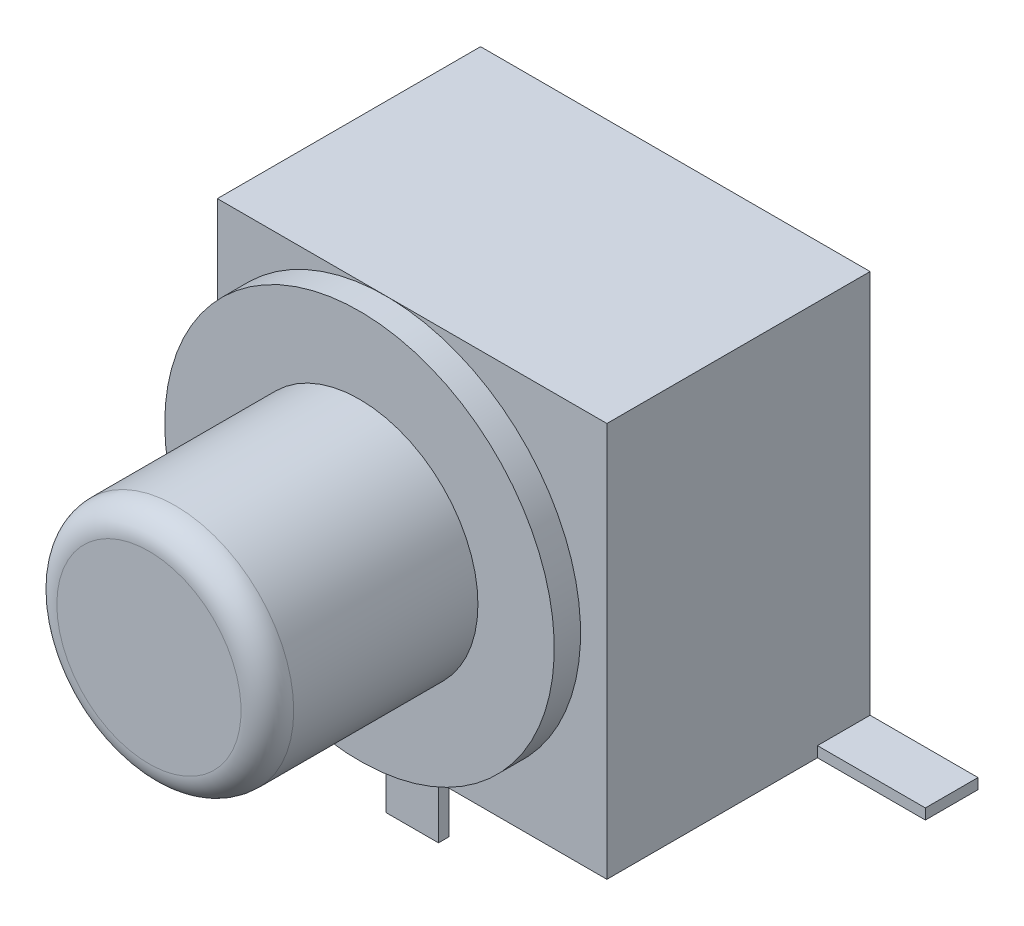
ISO-10303-21;
HEADER;
FILE_DESCRIPTION(('STEP AP214'),'2;1');
FILE_NAME('part.step','',(''),(''),'','','');
FILE_SCHEMA(('AUTOMOTIVE_DESIGN { 1 0 10303 214 1 1 1 1 }'));
ENDSEC;
DATA;
#1=APPLICATION_CONTEXT('core data for automotive mechanical design processes');
#2=APPLICATION_PROTOCOL_DEFINITION('international standard','automotive_design',2000,#1);
#3=PRODUCT_CONTEXT('',#1,'mechanical');
#4=PRODUCT('Part','Part','',(#3));
#5=PRODUCT_RELATED_PRODUCT_CATEGORY('part','',(#4));
#6=PRODUCT_DEFINITION_FORMATION('','',#4);
#7=PRODUCT_DEFINITION_CONTEXT('part definition',#1,'design');
#8=PRODUCT_DEFINITION('design','',#6,#7);
#9=PRODUCT_DEFINITION_SHAPE('','',#8);
#10=(LENGTH_UNIT() NAMED_UNIT(*) SI_UNIT(.MILLI.,.METRE.));
#11=(NAMED_UNIT(*) PLANE_ANGLE_UNIT() SI_UNIT($,.RADIAN.));
#12=(NAMED_UNIT(*) SI_UNIT($,.STERADIAN.) SOLID_ANGLE_UNIT());
#13=UNCERTAINTY_MEASURE_WITH_UNIT(LENGTH_MEASURE(1.E-05),#10,'distance_accuracy_value','');
#14=(GEOMETRIC_REPRESENTATION_CONTEXT(3) GLOBAL_UNCERTAINTY_ASSIGNED_CONTEXT((#13)) GLOBAL_UNIT_ASSIGNED_CONTEXT((#10,
#11,#12)) REPRESENTATION_CONTEXT('',''));
#15=CARTESIAN_POINT('',(0.,0.,0.));
#16=DIRECTION('',(0.,0.,1.));
#17=DIRECTION('',(1.,0.,0.));
#18=AXIS2_PLACEMENT_3D('',#15,#16,#17);
#19=CARTESIAN_POINT('',(-3.7,-3.75,5.));
#20=DIRECTION('',(0.,1.,0.));
#21=DIRECTION('',(-1.,0.,0.));
#22=AXIS2_PLACEMENT_3D('',#19,#20,#21);
#23=PLANE('',#22);
#24=DIRECTION('',(0.,0.,-1.));
#25=VECTOR('',#24,1.);
#26=CARTESIAN_POINT('',(-0.5,-3.75,5.));
#27=LINE('',#26,#25);
#28=CARTESIAN_POINT('',(-0.5,-3.75,5.));
#29=VERTEX_POINT('',#28);
#30=CARTESIAN_POINT('',(-0.5,-3.75,4.8));
#31=VERTEX_POINT('',#30);
#32=EDGE_CURVE('E207',#29,#31,#27,.T.);
#33=ORIENTED_EDGE('',*,*,#32,.F.);
#34=DIRECTION('',(1.,0.,0.));
#35=VECTOR('',#34,1.);
#36=CARTESIAN_POINT('',(-3.7,-3.75,5.));
#37=LINE('',#36,#35);
#38=CARTESIAN_POINT('',(-3.7,-3.75,5.));
#39=VERTEX_POINT('',#38);
#40=EDGE_CURVE('E274',#39,#29,#37,.T.);
#41=ORIENTED_EDGE('',*,*,#40,.F.);
#42=DIRECTION('',(0.,0.,-1.));
#43=VECTOR('',#42,1.);
#44=CARTESIAN_POINT('',(-3.7,-3.75,5.));
#45=LINE('',#44,#43);
#46=CARTESIAN_POINT('',(-3.7,-3.75,1.));
#47=VERTEX_POINT('',#46);
#48=EDGE_CURVE('E344',#39,#47,#45,.T.);
#49=ORIENTED_EDGE('',*,*,#48,.T.);
#50=DIRECTION('',(1.,0.,0.));
#51=VECTOR('',#50,1.);
#52=CARTESIAN_POINT('',(-5.75,-3.75,1.));
#53=LINE('',#52,#51);
#54=CARTESIAN_POINT('',(-5.75,-3.75,1.));
#55=VERTEX_POINT('',#54);
#56=EDGE_CURVE('E313',#55,#47,#53,.T.);
#57=ORIENTED_EDGE('',*,*,#56,.F.);
#58=DIRECTION('',(0.,0.,1.));
#59=VECTOR('',#58,1.);
#60=CARTESIAN_POINT('',(-5.75,-3.75,0.));
#61=LINE('',#60,#59);
#62=CARTESIAN_POINT('',(-5.75,-3.75,0.));
#63=VERTEX_POINT('',#62);
#64=EDGE_CURVE('E444',#63,#55,#61,.T.);
#65=ORIENTED_EDGE('',*,*,#64,.F.);
#66=DIRECTION('',(1.,0.,0.));
#67=VECTOR('',#66,1.);
#68=CARTESIAN_POINT('',(-3.7,-3.75,0.));
#69=LINE('',#68,#67);
#70=CARTESIAN_POINT('',(-2.6,-3.75,0.));
#71=VERTEX_POINT('',#70);
#72=EDGE_CURVE('E272',#63,#71,#69,.T.);
#73=ORIENTED_EDGE('',*,*,#72,.T.);
#74=DIRECTION('',(0.,0.,1.));
#75=VECTOR('',#74,1.);
#76=CARTESIAN_POINT('',(-2.6,-3.75,-1.));
#77=LINE('',#76,#75);
#78=CARTESIAN_POINT('',(-2.6,-3.75,-1.));
#79=VERTEX_POINT('',#78);
#80=EDGE_CURVE('E234',#79,#71,#77,.T.);
#81=ORIENTED_EDGE('',*,*,#80,.F.);
#82=DIRECTION('',(-1.,0.,0.));
#83=VECTOR('',#82,1.);
#84=CARTESIAN_POINT('',(-1.9,-3.75,-1.));
#85=LINE('',#84,#83);
#86=CARTESIAN_POINT('',(-1.9,-3.75,-1.));
#87=VERTEX_POINT('',#86);
#88=EDGE_CURVE('E219',#87,#79,#85,.T.);
#89=ORIENTED_EDGE('',*,*,#88,.F.);
#90=DIRECTION('',(0.,0.,1.));
#91=VECTOR('',#90,1.);
#92=CARTESIAN_POINT('',(-1.9,-3.75,-1.));
#93=LINE('',#92,#91);
#94=CARTESIAN_POINT('',(-1.9,-3.75,0.));
#95=VERTEX_POINT('',#94);
#96=EDGE_CURVE('E236',#87,#95,#93,.T.);
#97=ORIENTED_EDGE('',*,*,#96,.T.);
#98=CARTESIAN_POINT('',(1.9,-3.75,0.));
#99=VERTEX_POINT('',#98);
#100=EDGE_CURVE('E269',#95,#99,#69,.T.);
#101=ORIENTED_EDGE('',*,*,#100,.T.);
#102=DIRECTION('',(0.,0.,1.));
#103=VECTOR('',#102,1.);
#104=CARTESIAN_POINT('',(1.9,-3.75,-1.));
#105=LINE('',#104,#103);
#106=CARTESIAN_POINT('',(1.9,-3.75,-1.));
#107=VERTEX_POINT('',#106);
#108=EDGE_CURVE('E250',#107,#99,#105,.T.);
#109=ORIENTED_EDGE('',*,*,#108,.F.);
#110=DIRECTION('',(-1.,0.,0.));
#111=VECTOR('',#110,1.);
#112=CARTESIAN_POINT('',(1.9,-3.75,-1.));
#113=LINE('',#112,#111);
#114=CARTESIAN_POINT('',(2.6,-3.75,-1.));
#115=VERTEX_POINT('',#114);
#116=EDGE_CURVE('E248',#115,#107,#113,.T.);
#117=ORIENTED_EDGE('',*,*,#116,.F.);
#118=DIRECTION('',(0.,0.,1.));
#119=VECTOR('',#118,1.);
#120=CARTESIAN_POINT('',(2.6,-3.75,-1.));
#121=LINE('',#120,#119);
#122=CARTESIAN_POINT('',(2.6,-3.75,0.));
#123=VERTEX_POINT('',#122);
#124=EDGE_CURVE('E264',#115,#123,#121,.T.);
#125=ORIENTED_EDGE('',*,*,#124,.T.);
#126=CARTESIAN_POINT('',(5.75,-3.75,0.));
#127=VERTEX_POINT('',#126);
#128=EDGE_CURVE('E273',#123,#127,#69,.T.);
#129=ORIENTED_EDGE('',*,*,#128,.T.);
#130=DIRECTION('',(0.,0.,-1.));
#131=VECTOR('',#130,1.);
#132=CARTESIAN_POINT('',(5.75,-3.75,0.));
#133=LINE('',#132,#131);
#134=CARTESIAN_POINT('',(5.75,-3.75,1.));
#135=VERTEX_POINT('',#134);
#136=EDGE_CURVE('E322',#135,#127,#133,.T.);
#137=ORIENTED_EDGE('',*,*,#136,.F.);
#138=DIRECTION('',(-1.,0.,0.));
#139=VECTOR('',#138,1.);
#140=CARTESIAN_POINT('',(5.75,-3.75,1.));
#141=LINE('',#140,#139);
#142=CARTESIAN_POINT('',(3.7,-3.75,1.));
#143=VERTEX_POINT('',#142);
#144=EDGE_CURVE('E325',#135,#143,#141,.T.);
#145=ORIENTED_EDGE('',*,*,#144,.T.);
#146=DIRECTION('',(0.,0.,-1.));
#147=VECTOR('',#146,1.);
#148=CARTESIAN_POINT('',(3.7,-3.75,5.));
#149=LINE('',#148,#147);
#150=CARTESIAN_POINT('',(3.7,-3.75,5.));
#151=VERTEX_POINT('',#150);
#152=EDGE_CURVE('E349',#151,#143,#149,.T.);
#153=ORIENTED_EDGE('',*,*,#152,.F.);
#154=CARTESIAN_POINT('',(0.500000000000001,-3.75,5.));
#155=VERTEX_POINT('',#154);
#156=EDGE_CURVE('E58',#155,#151,#37,.T.);
#157=ORIENTED_EDGE('',*,*,#156,.F.);
#158=DIRECTION('',(0.,0.,1.));
#159=VECTOR('',#158,1.);
#160=CARTESIAN_POINT('',(0.5,-3.75,5.));
#161=LINE('',#160,#159);
#162=CARTESIAN_POINT('',(0.5,-3.75,4.8));
#163=VERTEX_POINT('',#162);
#164=EDGE_CURVE('E204',#163,#155,#161,.T.);
#165=ORIENTED_EDGE('',*,*,#164,.F.);
#166=DIRECTION('',(1.,0.,0.));
#167=VECTOR('',#166,1.);
#168=CARTESIAN_POINT('',(-0.5,-3.75,4.8));
#169=LINE('',#168,#167);
#170=EDGE_CURVE('E52',#31,#163,#169,.T.);
#171=ORIENTED_EDGE('',*,*,#170,.F.);
#172=EDGE_LOOP('',(#33,#41,#49,#57,#65,#73,#81,#89,#97,#101,#109,#117,#125,#129,#137,#145,#153,
#157,#165,#171));
#173=FACE_BOUND('',#172,.T.);
#174=ADVANCED_FACE('F35',(#173),#23,.F.);
#175=CARTESIAN_POINT('',(0.,0.,0.));
#176=DIRECTION('',(0.,0.,1.));
#177=DIRECTION('',(1.,0.,0.));
#178=AXIS2_PLACEMENT_3D('',#175,#176,#177);
#179=PLANE('',#178);
#180=DIRECTION('',(0.,-1.,0.));
#181=VECTOR('',#180,1.);
#182=CARTESIAN_POINT('',(-1.9,-3.55,0.));
#183=LINE('',#182,#181);
#184=CARTESIAN_POINT('',(-1.9,-3.55,0.));
#185=VERTEX_POINT('',#184);
#186=EDGE_CURVE('E208',#185,#95,#183,.T.);
#187=ORIENTED_EDGE('',*,*,#186,.F.);
#188=DIRECTION('',(1.,0.,0.));
#189=VECTOR('',#188,1.);
#190=CARTESIAN_POINT('',(-1.9,-3.55,0.));
#191=LINE('',#190,#189);
#192=CARTESIAN_POINT('',(-2.6,-3.55,0.));
#193=VERTEX_POINT('',#192);
#194=EDGE_CURVE('E220',#193,#185,#191,.T.);
#195=ORIENTED_EDGE('',*,*,#194,.F.);
#196=DIRECTION('',(0.,1.,0.));
#197=VECTOR('',#196,1.);
#198=CARTESIAN_POINT('',(-2.6,-3.55,0.));
#199=LINE('',#198,#197);
#200=EDGE_CURVE('E210',#71,#193,#199,.T.);
#201=ORIENTED_EDGE('',*,*,#200,.F.);
#202=ORIENTED_EDGE('',*,*,#72,.F.);
#203=DIRECTION('',(0.,-1.,0.));
#204=VECTOR('',#203,1.);
#205=CARTESIAN_POINT('',(-5.75,-3.75,0.));
#206=LINE('',#205,#204);
#207=CARTESIAN_POINT('',(-5.75,-3.55,0.));
#208=VERTEX_POINT('',#207);
#209=EDGE_CURVE('E303',#208,#63,#206,.T.);
#210=ORIENTED_EDGE('',*,*,#209,.F.);
#211=DIRECTION('',(1.,0.,0.));
#212=VECTOR('',#211,1.);
#213=CARTESIAN_POINT('',(-5.75,-3.55,0.));
#214=LINE('',#213,#212);
#215=CARTESIAN_POINT('',(-3.7,-3.55,0.));
#216=VERTEX_POINT('',#215);
#217=EDGE_CURVE('E294',#208,#216,#214,.T.);
#218=ORIENTED_EDGE('',*,*,#217,.T.);
#219=DIRECTION('',(0.,-1.,0.));
#220=VECTOR('',#219,1.);
#221=CARTESIAN_POINT('',(-3.7,3.75,0.));
#222=LINE('',#221,#220);
#223=CARTESIAN_POINT('',(-3.7,3.75,0.));
#224=VERTEX_POINT('',#223);
#225=EDGE_CURVE('E341',#224,#216,#222,.T.);
#226=ORIENTED_EDGE('',*,*,#225,.F.);
#227=DIRECTION('',(-1.,0.,0.));
#228=VECTOR('',#227,1.);
#229=CARTESIAN_POINT('',(-3.7,3.75,0.));
#230=LINE('',#229,#228);
#231=CARTESIAN_POINT('',(3.7,3.75,0.));
#232=VERTEX_POINT('',#231);
#233=EDGE_CURVE('E361',#232,#224,#230,.T.);
#234=ORIENTED_EDGE('',*,*,#233,.F.);
#235=DIRECTION('',(0.,1.,0.));
#236=VECTOR('',#235,1.);
#237=CARTESIAN_POINT('',(3.7,3.75,0.));
#238=LINE('',#237,#236);
#239=CARTESIAN_POINT('',(3.7,-3.54999999999999,0.));
#240=VERTEX_POINT('',#239);
#241=EDGE_CURVE('E291',#240,#232,#238,.T.);
#242=ORIENTED_EDGE('',*,*,#241,.F.);
#243=DIRECTION('',(-1.,0.,0.));
#244=VECTOR('',#243,1.);
#245=CARTESIAN_POINT('',(5.75,-3.55,0.));
#246=LINE('',#245,#244);
#247=CARTESIAN_POINT('',(5.75,-3.55,0.));
#248=VERTEX_POINT('',#247);
#249=EDGE_CURVE('E367',#248,#240,#246,.T.);
#250=ORIENTED_EDGE('',*,*,#249,.F.);
#251=DIRECTION('',(0.,1.,0.));
#252=VECTOR('',#251,1.);
#253=CARTESIAN_POINT('',(5.75,-3.75,0.));
#254=LINE('',#253,#252);
#255=EDGE_CURVE('E314',#127,#248,#254,.T.);
#256=ORIENTED_EDGE('',*,*,#255,.F.);
#257=ORIENTED_EDGE('',*,*,#128,.F.);
#258=DIRECTION('',(0.,-1.,0.));
#259=VECTOR('',#258,1.);
#260=CARTESIAN_POINT('',(2.6,-3.55,0.));
#261=LINE('',#260,#259);
#262=CARTESIAN_POINT('',(2.6,-3.55,0.));
#263=VERTEX_POINT('',#262);
#264=EDGE_CURVE('E244',#263,#123,#261,.T.);
#265=ORIENTED_EDGE('',*,*,#264,.F.);
#266=DIRECTION('',(1.,0.,0.));
#267=VECTOR('',#266,1.);
#268=CARTESIAN_POINT('',(1.9,-3.55,0.));
#269=LINE('',#268,#267);
#270=CARTESIAN_POINT('',(1.9,-3.55,0.));
#271=VERTEX_POINT('',#270);
#272=EDGE_CURVE('E251',#271,#263,#269,.T.);
#273=ORIENTED_EDGE('',*,*,#272,.F.);
#274=DIRECTION('',(0.,1.,0.));
#275=VECTOR('',#274,1.);
#276=CARTESIAN_POINT('',(1.9,-3.55,0.));
#277=LINE('',#276,#275);
#278=EDGE_CURVE('E239',#99,#271,#277,.T.);
#279=ORIENTED_EDGE('',*,*,#278,.F.);
#280=ORIENTED_EDGE('',*,*,#100,.F.);
#281=EDGE_LOOP('',(#187,#195,#201,#202,#210,#218,#226,#234,#242,#250,#256,#257,#265,#273,#279,#280));
#282=FACE_BOUND('',#281,.T.);
#283=ADVANCED_FACE('F389',(#282),#179,.F.);
#284=CARTESIAN_POINT('',(-3.7,3.75,5.));
#285=DIRECTION('',(1.,0.,0.));
#286=DIRECTION('',(0.,1.,0.));
#287=AXIS2_PLACEMENT_3D('',#284,#285,#286);
#288=PLANE('',#287);
#289=DIRECTION('',(0.,0.,-1.));
#290=VECTOR('',#289,1.);
#291=CARTESIAN_POINT('',(-3.7,-3.55,0.));
#292=LINE('',#291,#290);
#293=CARTESIAN_POINT('',(-3.7,-3.55,1.));
#294=VERTEX_POINT('',#293);
#295=EDGE_CURVE('E299',#294,#216,#292,.T.);
#296=ORIENTED_EDGE('',*,*,#295,.F.);
#297=DIRECTION('',(0.,1.,0.));
#298=VECTOR('',#297,1.);
#299=CARTESIAN_POINT('',(-3.7,-3.75,1.));
#300=LINE('',#299,#298);
#301=EDGE_CURVE('E304',#47,#294,#300,.T.);
#302=ORIENTED_EDGE('',*,*,#301,.F.);
#303=ORIENTED_EDGE('',*,*,#48,.F.);
#304=DIRECTION('',(0.,-1.,0.));
#305=VECTOR('',#304,1.);
#306=CARTESIAN_POINT('',(-3.7,3.75,5.));
#307=LINE('',#306,#305);
#308=CARTESIAN_POINT('',(-3.7,3.75,5.));
#309=VERTEX_POINT('',#308);
#310=EDGE_CURVE('E395',#309,#39,#307,.T.);
#311=ORIENTED_EDGE('',*,*,#310,.F.);
#312=DIRECTION('',(0.,0.,-1.));
#313=VECTOR('',#312,1.);
#314=CARTESIAN_POINT('',(-3.7,3.75,5.));
#315=LINE('',#314,#313);
#316=EDGE_CURVE('E399',#309,#224,#315,.T.);
#317=ORIENTED_EDGE('',*,*,#316,.T.);
#318=ORIENTED_EDGE('',*,*,#225,.T.);
#319=EDGE_LOOP('',(#296,#302,#303,#311,#317,#318));
#320=FACE_BOUND('',#319,.T.);
#321=ADVANCED_FACE('F481',(#320),#288,.F.);
#322=CARTESIAN_POINT('',(3.7,3.75,5.));
#323=DIRECTION('',(-1.,0.,0.));
#324=DIRECTION('',(0.,-1.,0.));
#325=AXIS2_PLACEMENT_3D('',#322,#323,#324);
#326=PLANE('',#325);
#327=DIRECTION('',(0.,-1.,0.));
#328=VECTOR('',#327,1.);
#329=CARTESIAN_POINT('',(3.7,-3.75,1.));
#330=LINE('',#329,#328);
#331=CARTESIAN_POINT('',(3.7,-3.55,1.));
#332=VERTEX_POINT('',#331);
#333=EDGE_CURVE('E318',#332,#143,#330,.T.);
#334=ORIENTED_EDGE('',*,*,#333,.F.);
#335=DIRECTION('',(0.,0.,1.));
#336=VECTOR('',#335,1.);
#337=CARTESIAN_POINT('',(3.7,-3.55,0.));
#338=LINE('',#337,#336);
#339=EDGE_CURVE('E334',#240,#332,#338,.T.);
#340=ORIENTED_EDGE('',*,*,#339,.F.);
#341=ORIENTED_EDGE('',*,*,#241,.T.);
#342=DIRECTION('',(0.,0.,-1.));
#343=VECTOR('',#342,1.);
#344=CARTESIAN_POINT('',(3.7,3.75,5.));
#345=LINE('',#344,#343);
#346=CARTESIAN_POINT('',(3.7,3.75,5.));
#347=VERTEX_POINT('',#346);
#348=EDGE_CURVE('E363',#347,#232,#345,.T.);
#349=ORIENTED_EDGE('',*,*,#348,.F.);
#350=DIRECTION('',(0.,1.,0.));
#351=VECTOR('',#350,1.);
#352=CARTESIAN_POINT('',(3.7,3.75,5.));
#353=LINE('',#352,#351);
#354=EDGE_CURVE('E404',#151,#347,#353,.T.);
#355=ORIENTED_EDGE('',*,*,#354,.F.);
#356=ORIENTED_EDGE('',*,*,#152,.T.);
#357=EDGE_LOOP('',(#334,#340,#341,#349,#355,#356));
#358=FACE_BOUND('',#357,.T.);
#359=ADVANCED_FACE('F383',(#358),#326,.F.);
#360=CARTESIAN_POINT('',(0.,0.550000000000001,7.2));
#361=DIRECTION('',(0.,0.,-1.));
#362=DIRECTION('',(-1.,0.,0.));
#363=AXIS2_PLACEMENT_3D('',#360,#361,#362);
#364=CYLINDRICAL_SURFACE('',#363,1.75);
#365=CARTESIAN_POINT('',(0.,0.550000000000001,5.));
#366=DIRECTION('',(0.,0.,1.));
#367=DIRECTION('',(1.,0.,0.));
#368=AXIS2_PLACEMENT_3D('',#365,#366,#367);
#369=CIRCLE('',#368,1.75);
#370=CARTESIAN_POINT('',(1.75,0.550000000000001,5.));
#371=VERTEX_POINT('',#370);
#372=EDGE_CURVE('E343',#371,#371,#369,.T.);
#373=ORIENTED_EDGE('',*,*,#372,.T.);
#374=EDGE_LOOP('',(#373));
#375=FACE_BOUND('',#374,.T.);
#376=CARTESIAN_POINT('',(0.,0.550000000000001,5.5));
#377=DIRECTION('',(0.,0.,1.));
#378=DIRECTION('',(1.,0.,0.));
#379=AXIS2_PLACEMENT_3D('',#376,#377,#378);
#380=CIRCLE('',#379,1.75);
#381=CARTESIAN_POINT('',(1.75,0.550000000000001,5.5));
#382=VERTEX_POINT('',#381);
#383=EDGE_CURVE('E348',#382,#382,#380,.T.);
#384=ORIENTED_EDGE('',*,*,#383,.F.);
#385=EDGE_LOOP('',(#384));
#386=FACE_BOUND('',#385,.T.);
#387=ADVANCED_FACE('F489',(#375,#386),#364,.T.);
#388=CARTESIAN_POINT('',(0.,0.,5.));
#389=DIRECTION('',(0.,0.,1.));
#390=DIRECTION('',(1.,0.,0.));
#391=AXIS2_PLACEMENT_3D('',#388,#389,#390);
#392=PLANE('',#391);
#393=ORIENTED_EDGE('',*,*,#310,.T.);
#394=ORIENTED_EDGE('',*,*,#40,.T.);
#395=DIRECTION('',(0.,1.,0.));
#396=VECTOR('',#395,1.);
#397=CARTESIAN_POINT('',(-0.499999999999999,-4.75,5.));
#398=LINE('',#397,#396);
#399=CARTESIAN_POINT('',(-0.499999999999999,-4.75,5.));
#400=VERTEX_POINT('',#399);
#401=EDGE_CURVE('E415',#400,#29,#398,.T.);
#402=ORIENTED_EDGE('',*,*,#401,.F.);
#403=DIRECTION('',(-1.,0.,0.));
#404=VECTOR('',#403,1.);
#405=CARTESIAN_POINT('',(-0.499999999999999,-4.75,5.));
#406=LINE('',#405,#404);
#407=CARTESIAN_POINT('',(0.500000000000001,-4.75,5.));
#408=VERTEX_POINT('',#407);
#409=EDGE_CURVE('E200',#408,#400,#406,.T.);
#410=ORIENTED_EDGE('',*,*,#409,.F.);
#411=DIRECTION('',(0.,1.,0.));
#412=VECTOR('',#411,1.);
#413=CARTESIAN_POINT('',(0.500000000000001,-4.75,5.));
#414=LINE('',#413,#412);
#415=EDGE_CURVE('E212',#408,#155,#414,.T.);
#416=ORIENTED_EDGE('',*,*,#415,.T.);
#417=ORIENTED_EDGE('',*,*,#156,.T.);
#418=ORIENTED_EDGE('',*,*,#354,.T.);
#419=DIRECTION('',(-1.,0.,0.));
#420=VECTOR('',#419,1.);
#421=CARTESIAN_POINT('',(-3.7,3.75,5.));
#422=LINE('',#421,#420);
#423=EDGE_CURVE('E400',#347,#309,#422,.T.);
#424=ORIENTED_EDGE('',*,*,#423,.T.);
#425=EDGE_LOOP('',(#393,#394,#402,#410,#416,#417,#418,#424));
#426=FACE_BOUND('',#425,.T.);
#427=ORIENTED_EDGE('',*,*,#372,.F.);
#428=EDGE_LOOP('',(#427));
#429=FACE_BOUND('',#428,.T.);
#430=ADVANCED_FACE('F427',(#426,#429),#392,.T.);
#431=CARTESIAN_POINT('',(-3.7,3.75,5.));
#432=DIRECTION('',(0.,-1.,0.));
#433=DIRECTION('',(1.,0.,0.));
#434=AXIS2_PLACEMENT_3D('',#431,#432,#433);
#435=PLANE('',#434);
#436=ORIENTED_EDGE('',*,*,#233,.T.);
#437=ORIENTED_EDGE('',*,*,#316,.F.);
#438=ORIENTED_EDGE('',*,*,#423,.F.);
#439=ORIENTED_EDGE('',*,*,#348,.T.);
#440=EDGE_LOOP('',(#436,#437,#438,#439));
#441=FACE_BOUND('',#440,.T.);
#442=ADVANCED_FACE('F402',(#441),#435,.F.);
#443=CARTESIAN_POINT('',(0.,0.55,5.5));
#444=DIRECTION('',(0.,0.,1.));
#445=DIRECTION('',(1.,0.,0.));
#446=AXIS2_PLACEMENT_3D('',#443,#444,#445);
#447=PLANE('',#446);
#448=CARTESIAN_POINT('',(0.,0.55,5.5));
#449=DIRECTION('',(0.,0.,-1.));
#450=DIRECTION('',(-1.,0.,0.));
#451=AXIS2_PLACEMENT_3D('',#448,#449,#450);
#452=CIRCLE('',#451,3.7);
#453=CARTESIAN_POINT('',(-3.7,0.55,5.5));
#454=VERTEX_POINT('',#453);
#455=EDGE_CURVE('E369',#454,#454,#452,.T.);
#456=ORIENTED_EDGE('',*,*,#455,.T.);
#457=EDGE_LOOP('',(#456));
#458=FACE_BOUND('',#457,.T.);
#459=ORIENTED_EDGE('',*,*,#383,.T.);
#460=EDGE_LOOP('',(#459));
#461=FACE_BOUND('',#460,.T.);
#462=ADVANCED_FACE('F639',(#458,#461),#447,.F.);
#463=CARTESIAN_POINT('',(2.25,0.55,10.));
#464=DIRECTION('',(0.,0.,-1.));
#465=DIRECTION('',(-1.,0.,0.));
#466=AXIS2_PLACEMENT_3D('',#463,#464,#465);
#467=PLANE('',#466);
#468=CARTESIAN_POINT('',(0.,0.55,10.));
#469=DIRECTION('',(0.,0.,-1.));
#470=DIRECTION('',(-1.,0.,0.));
#471=AXIS2_PLACEMENT_3D('',#468,#469,#470);
#472=CIRCLE('',#471,1.75);
#473=CARTESIAN_POINT('',(-1.75,0.55,10.));
#474=VERTEX_POINT('',#473);
#475=EDGE_CURVE('E11',#474,#474,#472,.F.);
#476=ORIENTED_EDGE('',*,*,#475,.T.);
#477=EDGE_LOOP('',(#476));
#478=FACE_BOUND('',#477,.T.);
#479=ADVANCED_FACE('F645',(#478),#467,.F.);
#480=CARTESIAN_POINT('',(0.,0.55,-1.83117888934429));
#481=DIRECTION('',(0.,0.,-1.));
#482=DIRECTION('',(-1.,0.,0.));
#483=AXIS2_PLACEMENT_3D('',#480,#481,#482);
#484=CYLINDRICAL_SURFACE('',#483,2.25);
#485=CARTESIAN_POINT('',(0.,0.55,9.5));
#486=DIRECTION('',(0.,0.,-1.));
#487=DIRECTION('',(-1.,0.,0.));
#488=AXIS2_PLACEMENT_3D('',#485,#486,#487);
#489=CIRCLE('',#488,2.25);
#490=CARTESIAN_POINT('',(-2.25,0.55,9.5));
#491=VERTEX_POINT('',#490);
#492=EDGE_CURVE('E44',#491,#491,#489,.T.);
#493=ORIENTED_EDGE('',*,*,#492,.T.);
#494=EDGE_LOOP('',(#493));
#495=FACE_BOUND('',#494,.T.);
#496=CARTESIAN_POINT('',(0.,0.55,6.));
#497=DIRECTION('',(0.,0.,-1.));
#498=DIRECTION('',(-1.,0.,0.));
#499=AXIS2_PLACEMENT_3D('',#496,#497,#498);
#500=CIRCLE('',#499,2.25);
#501=CARTESIAN_POINT('',(-2.25,0.55,6.));
#502=VERTEX_POINT('',#501);
#503=EDGE_CURVE('E769',#502,#502,#500,.T.);
#504=ORIENTED_EDGE('',*,*,#503,.F.);
#505=EDGE_LOOP('',(#504));
#506=FACE_BOUND('',#505,.T.);
#507=ADVANCED_FACE('F654',(#495,#506),#484,.T.);
#508=CARTESIAN_POINT('',(3.7,0.550000000000001,6.));
#509=DIRECTION('',(0.,0.,-1.));
#510=DIRECTION('',(-1.,0.,0.));
#511=AXIS2_PLACEMENT_3D('',#508,#509,#510);
#512=PLANE('',#511);
#513=CARTESIAN_POINT('',(0.,0.55,6.));
#514=DIRECTION('',(0.,0.,-1.));
#515=DIRECTION('',(-1.,0.,0.));
#516=AXIS2_PLACEMENT_3D('',#513,#514,#515);
#517=CIRCLE('',#516,3.7);
#518=CARTESIAN_POINT('',(-3.7,0.55,6.));
#519=VERTEX_POINT('',#518);
#520=EDGE_CURVE('E373',#519,#519,#517,.T.);
#521=ORIENTED_EDGE('',*,*,#520,.F.);
#522=EDGE_LOOP('',(#521));
#523=FACE_BOUND('',#522,.T.);
#524=ORIENTED_EDGE('',*,*,#503,.T.);
#525=EDGE_LOOP('',(#524));
#526=FACE_BOUND('',#525,.T.);
#527=ADVANCED_FACE('F663',(#523,#526),#512,.F.);
#528=CARTESIAN_POINT('',(0.,0.55,-1.83117888934429));
#529=DIRECTION('',(0.,0.,-1.));
#530=DIRECTION('',(-1.,0.,0.));
#531=AXIS2_PLACEMENT_3D('',#528,#529,#530);
#532=CYLINDRICAL_SURFACE('',#531,3.7);
#533=ORIENTED_EDGE('',*,*,#455,.F.);
#534=EDGE_LOOP('',(#533));
#535=FACE_BOUND('',#534,.T.);
#536=ORIENTED_EDGE('',*,*,#520,.T.);
#537=EDGE_LOOP('',(#536));
#538=FACE_BOUND('',#537,.T.);
#539=ADVANCED_FACE('F671',(#535,#538),#532,.T.);
#540=CARTESIAN_POINT('',(0.,0.55,9.5));
#541=DIRECTION('',(0.,0.,-1.));
#542=DIRECTION('',(-1.,0.,0.));
#543=AXIS2_PLACEMENT_3D('',#540,#541,#542);
#544=TOROIDAL_SURFACE('',#543,1.75,0.5);
#545=ORIENTED_EDGE('',*,*,#475,.F.);
#546=EDGE_LOOP('',(#545));
#547=FACE_BOUND('',#546,.T.);
#548=ORIENTED_EDGE('',*,*,#492,.F.);
#549=EDGE_LOOP('',(#548));
#550=FACE_BOUND('',#549,.T.);
#551=ADVANCED_FACE('F37',(#547,#550),#544,.T.);
#552=CARTESIAN_POINT('',(5.75,-3.55,0.));
#553=DIRECTION('',(0.,-1.,0.));
#554=DIRECTION('',(1.,0.,0.));
#555=AXIS2_PLACEMENT_3D('',#552,#553,#554);
#556=PLANE('',#555);
#557=ORIENTED_EDGE('',*,*,#339,.T.);
#558=DIRECTION('',(-1.,0.,0.));
#559=VECTOR('',#558,1.);
#560=CARTESIAN_POINT('',(5.75,-3.55,1.));
#561=LINE('',#560,#559);
#562=CARTESIAN_POINT('',(5.75,-3.55,1.));
#563=VERTEX_POINT('',#562);
#564=EDGE_CURVE('E328',#563,#332,#561,.T.);
#565=ORIENTED_EDGE('',*,*,#564,.F.);
#566=DIRECTION('',(0.,0.,1.));
#567=VECTOR('',#566,1.);
#568=CARTESIAN_POINT('',(5.75,-3.55,0.));
#569=LINE('',#568,#567);
#570=EDGE_CURVE('E317',#248,#563,#569,.T.);
#571=ORIENTED_EDGE('',*,*,#570,.F.);
#572=ORIENTED_EDGE('',*,*,#249,.T.);
#573=EDGE_LOOP('',(#557,#565,#571,#572));
#574=FACE_BOUND('',#573,.T.);
#575=ADVANCED_FACE('F380',(#574),#556,.F.);
#576=CARTESIAN_POINT('',(5.75,-3.75,1.));
#577=DIRECTION('',(0.,0.,-1.));
#578=DIRECTION('',(-1.,0.,0.));
#579=AXIS2_PLACEMENT_3D('',#576,#577,#578);
#580=PLANE('',#579);
#581=ORIENTED_EDGE('',*,*,#333,.T.);
#582=ORIENTED_EDGE('',*,*,#144,.F.);
#583=DIRECTION('',(0.,-1.,0.));
#584=VECTOR('',#583,1.);
#585=CARTESIAN_POINT('',(5.75,-3.75,1.));
#586=LINE('',#585,#584);
#587=EDGE_CURVE('E320',#563,#135,#586,.T.);
#588=ORIENTED_EDGE('',*,*,#587,.F.);
#589=ORIENTED_EDGE('',*,*,#564,.T.);
#590=EDGE_LOOP('',(#581,#582,#588,#589));
#591=FACE_BOUND('',#590,.T.);
#592=ADVANCED_FACE('F378',(#591),#580,.F.);
#593=CARTESIAN_POINT('',(5.74999999999999,0.,0.));
#594=DIRECTION('',(1.,0.,0.));
#595=DIRECTION('',(0.,1.,0.));
#596=AXIS2_PLACEMENT_3D('',#593,#594,#595);
#597=PLANE('',#596);
#598=ORIENTED_EDGE('',*,*,#255,.T.);
#599=ORIENTED_EDGE('',*,*,#570,.T.);
#600=ORIENTED_EDGE('',*,*,#587,.T.);
#601=ORIENTED_EDGE('',*,*,#136,.T.);
#602=EDGE_LOOP('',(#598,#599,#600,#601));
#603=FACE_BOUND('',#602,.T.);
#604=ADVANCED_FACE('F466',(#603),#597,.T.);
#605=CARTESIAN_POINT('',(-5.75,-3.75,1.));
#606=DIRECTION('',(0.,0.,-1.));
#607=DIRECTION('',(-1.,0.,0.));
#608=AXIS2_PLACEMENT_3D('',#605,#606,#607);
#609=PLANE('',#608);
#610=ORIENTED_EDGE('',*,*,#301,.T.);
#611=DIRECTION('',(1.,0.,0.));
#612=VECTOR('',#611,1.);
#613=CARTESIAN_POINT('',(-5.75,-3.55,1.));
#614=LINE('',#613,#612);
#615=CARTESIAN_POINT('',(-5.75,-3.55,1.));
#616=VERTEX_POINT('',#615);
#617=EDGE_CURVE('E297',#616,#294,#614,.T.);
#618=ORIENTED_EDGE('',*,*,#617,.F.);
#619=DIRECTION('',(0.,1.,0.));
#620=VECTOR('',#619,1.);
#621=CARTESIAN_POINT('',(-5.75,-3.75,1.));
#622=LINE('',#621,#620);
#623=EDGE_CURVE('E440',#55,#616,#622,.T.);
#624=ORIENTED_EDGE('',*,*,#623,.F.);
#625=ORIENTED_EDGE('',*,*,#56,.T.);
#626=EDGE_LOOP('',(#610,#618,#624,#625));
#627=FACE_BOUND('',#626,.T.);
#628=ADVANCED_FACE('F438',(#627),#609,.F.);
#629=CARTESIAN_POINT('',(-5.75,-3.55,0.));
#630=DIRECTION('',(0.,-1.,0.));
#631=DIRECTION('',(1.,0.,0.));
#632=AXIS2_PLACEMENT_3D('',#629,#630,#631);
#633=PLANE('',#632);
#634=ORIENTED_EDGE('',*,*,#295,.T.);
#635=ORIENTED_EDGE('',*,*,#217,.F.);
#636=DIRECTION('',(0.,0.,-1.));
#637=VECTOR('',#636,1.);
#638=CARTESIAN_POINT('',(-5.75,-3.55,0.));
#639=LINE('',#638,#637);
#640=EDGE_CURVE('E298',#616,#208,#639,.T.);
#641=ORIENTED_EDGE('',*,*,#640,.F.);
#642=ORIENTED_EDGE('',*,*,#617,.T.);
#643=EDGE_LOOP('',(#634,#635,#641,#642));
#644=FACE_BOUND('',#643,.T.);
#645=ADVANCED_FACE('F473',(#644),#633,.F.);
#646=CARTESIAN_POINT('',(-5.75000000000001,0.,0.));
#647=DIRECTION('',(1.,0.,0.));
#648=DIRECTION('',(0.,1.,0.));
#649=AXIS2_PLACEMENT_3D('',#646,#647,#648);
#650=PLANE('',#649);
#651=ORIENTED_EDGE('',*,*,#209,.T.);
#652=ORIENTED_EDGE('',*,*,#64,.T.);
#653=ORIENTED_EDGE('',*,*,#623,.T.);
#654=ORIENTED_EDGE('',*,*,#640,.T.);
#655=EDGE_LOOP('',(#651,#652,#653,#654));
#656=FACE_BOUND('',#655,.T.);
#657=ADVANCED_FACE('F494',(#656),#650,.F.);
#658=CARTESIAN_POINT('',(1.9,-3.55,-1.));
#659=DIRECTION('',(1.,0.,0.));
#660=DIRECTION('',(0.,1.,0.));
#661=AXIS2_PLACEMENT_3D('',#658,#659,#660);
#662=PLANE('',#661);
#663=ORIENTED_EDGE('',*,*,#278,.T.);
#664=DIRECTION('',(0.,0.,1.));
#665=VECTOR('',#664,1.);
#666=CARTESIAN_POINT('',(1.9,-3.55,-1.));
#667=LINE('',#666,#665);
#668=CARTESIAN_POINT('',(1.9,-3.55,-1.));
#669=VERTEX_POINT('',#668);
#670=EDGE_CURVE('E448',#669,#271,#667,.T.);
#671=ORIENTED_EDGE('',*,*,#670,.F.);
#672=DIRECTION('',(0.,1.,0.));
#673=VECTOR('',#672,1.);
#674=CARTESIAN_POINT('',(1.9,-3.55,-1.));
#675=LINE('',#674,#673);
#676=EDGE_CURVE('E240',#107,#669,#675,.T.);
#677=ORIENTED_EDGE('',*,*,#676,.F.);
#678=ORIENTED_EDGE('',*,*,#108,.T.);
#679=EDGE_LOOP('',(#663,#671,#677,#678));
#680=FACE_BOUND('',#679,.T.);
#681=ADVANCED_FACE('F532',(#680),#662,.F.);
#682=CARTESIAN_POINT('',(1.9,-3.55,-1.));
#683=DIRECTION('',(0.,-1.,0.));
#684=DIRECTION('',(1.,0.,0.));
#685=AXIS2_PLACEMENT_3D('',#682,#683,#684);
#686=PLANE('',#685);
#687=ORIENTED_EDGE('',*,*,#272,.T.);
#688=DIRECTION('',(0.,0.,1.));
#689=VECTOR('',#688,1.);
#690=CARTESIAN_POINT('',(2.6,-3.55,-1.));
#691=LINE('',#690,#689);
#692=CARTESIAN_POINT('',(2.6,-3.55,-1.));
#693=VERTEX_POINT('',#692);
#694=EDGE_CURVE('E256',#693,#263,#691,.T.);
#695=ORIENTED_EDGE('',*,*,#694,.F.);
#696=DIRECTION('',(1.,0.,0.));
#697=VECTOR('',#696,1.);
#698=CARTESIAN_POINT('',(1.9,-3.55,-1.));
#699=LINE('',#698,#697);
#700=EDGE_CURVE('E243',#669,#693,#699,.T.);
#701=ORIENTED_EDGE('',*,*,#700,.F.);
#702=ORIENTED_EDGE('',*,*,#670,.T.);
#703=EDGE_LOOP('',(#687,#695,#701,#702));
#704=FACE_BOUND('',#703,.T.);
#705=ADVANCED_FACE('F459',(#704),#686,.F.);
#706=CARTESIAN_POINT('',(2.6,-3.55,-1.));
#707=DIRECTION('',(-1.,0.,0.));
#708=DIRECTION('',(0.,-1.,0.));
#709=AXIS2_PLACEMENT_3D('',#706,#707,#708);
#710=PLANE('',#709);
#711=ORIENTED_EDGE('',*,*,#264,.T.);
#712=ORIENTED_EDGE('',*,*,#124,.F.);
#713=DIRECTION('',(0.,-1.,0.));
#714=VECTOR('',#713,1.);
#715=CARTESIAN_POINT('',(2.6,-3.55,-1.));
#716=LINE('',#715,#714);
#717=EDGE_CURVE('E246',#693,#115,#716,.T.);
#718=ORIENTED_EDGE('',*,*,#717,.F.);
#719=ORIENTED_EDGE('',*,*,#694,.T.);
#720=EDGE_LOOP('',(#711,#712,#718,#719));
#721=FACE_BOUND('',#720,.T.);
#722=ADVANCED_FACE('F457',(#721),#710,.F.);
#723=CARTESIAN_POINT('',(0.,0.,-1.));
#724=DIRECTION('',(0.,0.,1.));
#725=DIRECTION('',(1.,0.,0.));
#726=AXIS2_PLACEMENT_3D('',#723,#724,#725);
#727=PLANE('',#726);
#728=ORIENTED_EDGE('',*,*,#676,.T.);
#729=ORIENTED_EDGE('',*,*,#700,.T.);
#730=ORIENTED_EDGE('',*,*,#717,.T.);
#731=ORIENTED_EDGE('',*,*,#116,.T.);
#732=EDGE_LOOP('',(#728,#729,#730,#731));
#733=FACE_BOUND('',#732,.T.);
#734=ADVANCED_FACE('F524',(#733),#727,.F.);
#735=CARTESIAN_POINT('',(-1.9,-3.55,-1.));
#736=DIRECTION('',(-1.,0.,0.));
#737=DIRECTION('',(0.,0.,1.));
#738=AXIS2_PLACEMENT_3D('',#735,#736,#737);
#739=PLANE('',#738);
#740=ORIENTED_EDGE('',*,*,#186,.T.);
#741=ORIENTED_EDGE('',*,*,#96,.F.);
#742=DIRECTION('',(0.,-1.,0.));
#743=VECTOR('',#742,1.);
#744=CARTESIAN_POINT('',(-1.9,-3.55,-1.));
#745=LINE('',#744,#743);
#746=CARTESIAN_POINT('',(-1.9,-3.55,-1.));
#747=VERTEX_POINT('',#746);
#748=EDGE_CURVE('E216',#747,#87,#745,.T.);
#749=ORIENTED_EDGE('',*,*,#748,.F.);
#750=DIRECTION('',(0.,0.,1.));
#751=VECTOR('',#750,1.);
#752=CARTESIAN_POINT('',(-1.9,-3.55,-1.));
#753=LINE('',#752,#751);
#754=EDGE_CURVE('E225',#747,#185,#753,.T.);
#755=ORIENTED_EDGE('',*,*,#754,.T.);
#756=EDGE_LOOP('',(#740,#741,#749,#755));
#757=FACE_BOUND('',#756,.T.);
#758=ADVANCED_FACE('F507',(#757),#739,.F.);
#759=CARTESIAN_POINT('',(-2.6,-3.55,-1.));
#760=DIRECTION('',(1.,0.,0.));
#761=DIRECTION('',(0.,1.,0.));
#762=AXIS2_PLACEMENT_3D('',#759,#760,#761);
#763=PLANE('',#762);
#764=ORIENTED_EDGE('',*,*,#200,.T.);
#765=DIRECTION('',(0.,0.,1.));
#766=VECTOR('',#765,1.);
#767=CARTESIAN_POINT('',(-2.6,-3.55,-1.));
#768=LINE('',#767,#766);
#769=CARTESIAN_POINT('',(-2.6,-3.55,-1.));
#770=VERTEX_POINT('',#769);
#771=EDGE_CURVE('E231',#770,#193,#768,.T.);
#772=ORIENTED_EDGE('',*,*,#771,.F.);
#773=DIRECTION('',(0.,1.,0.));
#774=VECTOR('',#773,1.);
#775=CARTESIAN_POINT('',(-2.6,-3.55,-1.));
#776=LINE('',#775,#774);
#777=EDGE_CURVE('E222',#79,#770,#776,.T.);
#778=ORIENTED_EDGE('',*,*,#777,.F.);
#779=ORIENTED_EDGE('',*,*,#80,.T.);
#780=EDGE_LOOP('',(#764,#772,#778,#779));
#781=FACE_BOUND('',#780,.T.);
#782=ADVANCED_FACE('F499',(#781),#763,.F.);
#783=CARTESIAN_POINT('',(-1.9,-3.55,-1.));
#784=DIRECTION('',(0.,-1.,0.));
#785=DIRECTION('',(0.,0.,-1.));
#786=AXIS2_PLACEMENT_3D('',#783,#784,#785);
#787=PLANE('',#786);
#788=ORIENTED_EDGE('',*,*,#194,.T.);
#789=ORIENTED_EDGE('',*,*,#754,.F.);
#790=DIRECTION('',(1.,0.,0.));
#791=VECTOR('',#790,1.);
#792=CARTESIAN_POINT('',(-1.9,-3.55,-1.));
#793=LINE('',#792,#791);
#794=EDGE_CURVE('E224',#770,#747,#793,.T.);
#795=ORIENTED_EDGE('',*,*,#794,.F.);
#796=ORIENTED_EDGE('',*,*,#771,.T.);
#797=EDGE_LOOP('',(#788,#789,#795,#796));
#798=FACE_BOUND('',#797,.T.);
#799=ADVANCED_FACE('F511',(#798),#787,.F.);
#800=CARTESIAN_POINT('',(0.,0.,-1.));
#801=DIRECTION('',(0.,0.,-1.));
#802=DIRECTION('',(-1.,0.,0.));
#803=AXIS2_PLACEMENT_3D('',#800,#801,#802);
#804=PLANE('',#803);
#805=ORIENTED_EDGE('',*,*,#748,.T.);
#806=ORIENTED_EDGE('',*,*,#88,.T.);
#807=ORIENTED_EDGE('',*,*,#777,.T.);
#808=ORIENTED_EDGE('',*,*,#794,.T.);
#809=EDGE_LOOP('',(#805,#806,#807,#808));
#810=FACE_BOUND('',#809,.T.);
#811=ADVANCED_FACE('F502',(#810),#804,.T.);
#812=CARTESIAN_POINT('',(-0.499999999999999,-4.75,5.));
#813=DIRECTION('',(1.,0.,0.));
#814=DIRECTION('',(0.,0.,-1.));
#815=AXIS2_PLACEMENT_3D('',#812,#813,#814);
#816=PLANE('',#815);
#817=ORIENTED_EDGE('',*,*,#32,.T.);
#818=DIRECTION('',(0.,1.,0.));
#819=VECTOR('',#818,1.);
#820=CARTESIAN_POINT('',(-0.5,-4.75,4.8));
#821=LINE('',#820,#819);
#822=CARTESIAN_POINT('',(-0.5,-4.75,4.8));
#823=VERTEX_POINT('',#822);
#824=EDGE_CURVE('E188',#823,#31,#821,.T.);
#825=ORIENTED_EDGE('',*,*,#824,.F.);
#826=DIRECTION('',(0.,0.,-1.));
#827=VECTOR('',#826,1.);
#828=CARTESIAN_POINT('',(-0.499999999999999,-4.75,5.));
#829=LINE('',#828,#827);
#830=EDGE_CURVE('E195',#400,#823,#829,.T.);
#831=ORIENTED_EDGE('',*,*,#830,.F.);
#832=ORIENTED_EDGE('',*,*,#401,.T.);
#833=EDGE_LOOP('',(#817,#825,#831,#832));
#834=FACE_BOUND('',#833,.T.);
#835=ADVANCED_FACE('F206',(#834),#816,.F.);
#836=CARTESIAN_POINT('',(-0.5,-4.75,4.8));
#837=DIRECTION('',(0.,0.,1.));
#838=DIRECTION('',(1.,0.,0.));
#839=AXIS2_PLACEMENT_3D('',#836,#837,#838);
#840=PLANE('',#839);
#841=ORIENTED_EDGE('',*,*,#170,.T.);
#842=DIRECTION('',(0.,1.,0.));
#843=VECTOR('',#842,1.);
#844=CARTESIAN_POINT('',(0.5,-4.75,4.8));
#845=LINE('',#844,#843);
#846=CARTESIAN_POINT('',(0.5,-4.75,4.8));
#847=VERTEX_POINT('',#846);
#848=EDGE_CURVE('E191',#847,#163,#845,.T.);
#849=ORIENTED_EDGE('',*,*,#848,.F.);
#850=DIRECTION('',(1.,0.,0.));
#851=VECTOR('',#850,1.);
#852=CARTESIAN_POINT('',(-0.5,-4.75,4.8));
#853=LINE('',#852,#851);
#854=EDGE_CURVE('E184',#823,#847,#853,.T.);
#855=ORIENTED_EDGE('',*,*,#854,.F.);
#856=ORIENTED_EDGE('',*,*,#824,.T.);
#857=EDGE_LOOP('',(#841,#849,#855,#856));
#858=FACE_BOUND('',#857,.T.);
#859=ADVANCED_FACE('F186',(#858),#840,.F.);
#860=CARTESIAN_POINT('',(0.500000000000001,-4.75,5.));
#861=DIRECTION('',(-1.,0.,0.));
#862=DIRECTION('',(0.,0.,1.));
#863=AXIS2_PLACEMENT_3D('',#860,#861,#862);
#864=PLANE('',#863);
#865=ORIENTED_EDGE('',*,*,#164,.T.);
#866=ORIENTED_EDGE('',*,*,#415,.F.);
#867=DIRECTION('',(0.,0.,1.));
#868=VECTOR('',#867,1.);
#869=CARTESIAN_POINT('',(0.500000000000001,-4.75,5.));
#870=LINE('',#869,#868);
#871=EDGE_CURVE('E194',#847,#408,#870,.T.);
#872=ORIENTED_EDGE('',*,*,#871,.F.);
#873=ORIENTED_EDGE('',*,*,#848,.T.);
#874=EDGE_LOOP('',(#865,#866,#872,#873));
#875=FACE_BOUND('',#874,.T.);
#876=ADVANCED_FACE('F426',(#875),#864,.F.);
#877=CARTESIAN_POINT('',(0.,-4.75,0.));
#878=DIRECTION('',(0.,-1.,0.));
#879=DIRECTION('',(0.,0.,-1.));
#880=AXIS2_PLACEMENT_3D('',#877,#878,#879);
#881=PLANE('',#880);
#882=ORIENTED_EDGE('',*,*,#830,.T.);
#883=ORIENTED_EDGE('',*,*,#854,.T.);
#884=ORIENTED_EDGE('',*,*,#871,.T.);
#885=ORIENTED_EDGE('',*,*,#409,.T.);
#886=EDGE_LOOP('',(#882,#883,#884,#885));
#887=FACE_BOUND('',#886,.T.);
#888=ADVANCED_FACE('F198',(#887),#881,.T.);
#889=CLOSED_SHELL('',(#174,#283,#321,#359,#387,#430,#442,#462,#479,#507,#527,#539,#551,#575,
#592,#604,#628,#645,#657,#681,#705,#722,#734,#758,#782,#799,#811,#835,#859,#876,#888));
#890=MANIFOLD_SOLID_BREP('B2',#889);
#891=ADVANCED_BREP_SHAPE_REPRESENTATION('',(#18,#890),#14);
#892=SHAPE_DEFINITION_REPRESENTATION(#9,#891);
ENDSEC;
END-ISO-10303-21;
